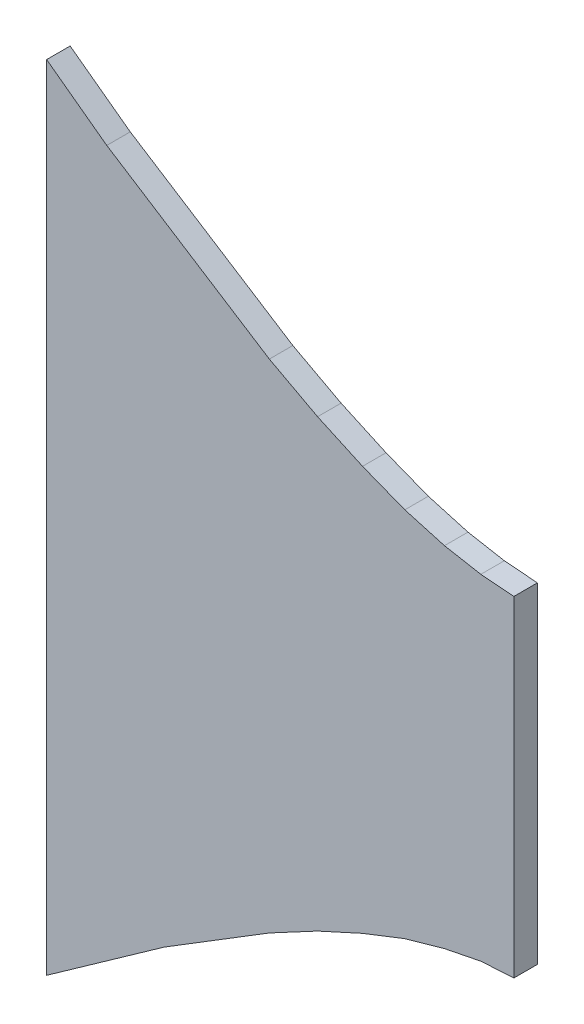
ISO-10303-21;
HEADER;
FILE_DESCRIPTION(('STEP AP214'),'2;1');
FILE_NAME('part.step','',(''),(''),'','','');
FILE_SCHEMA(('AUTOMOTIVE_DESIGN { 1 0 10303 214 1 1 1 1 }'));
ENDSEC;
DATA;
#1=APPLICATION_CONTEXT('core data for automotive mechanical design processes');
#2=APPLICATION_PROTOCOL_DEFINITION('international standard','automotive_design',2000,#1);
#3=PRODUCT_CONTEXT('',#1,'mechanical');
#4=PRODUCT('Part','Part','',(#3));
#5=PRODUCT_RELATED_PRODUCT_CATEGORY('part','',(#4));
#6=PRODUCT_DEFINITION_FORMATION('','',#4);
#7=PRODUCT_DEFINITION_CONTEXT('part definition',#1,'design');
#8=PRODUCT_DEFINITION('design','',#6,#7);
#9=PRODUCT_DEFINITION_SHAPE('','',#8);
#10=(LENGTH_UNIT() NAMED_UNIT(*) SI_UNIT(.MILLI.,.METRE.));
#11=(NAMED_UNIT(*) PLANE_ANGLE_UNIT() SI_UNIT($,.RADIAN.));
#12=(NAMED_UNIT(*) SI_UNIT($,.STERADIAN.) SOLID_ANGLE_UNIT());
#13=UNCERTAINTY_MEASURE_WITH_UNIT(LENGTH_MEASURE(1.E-05),#10,'distance_accuracy_value','');
#14=(GEOMETRIC_REPRESENTATION_CONTEXT(3) GLOBAL_UNCERTAINTY_ASSIGNED_CONTEXT((#13)) GLOBAL_UNIT_ASSIGNED_CONTEXT((#10,
#11,#12)) REPRESENTATION_CONTEXT('',''));
#15=CARTESIAN_POINT('',(0.,0.,0.));
#16=DIRECTION('',(0.,0.,1.));
#17=DIRECTION('',(1.,0.,0.));
#18=AXIS2_PLACEMENT_3D('',#15,#16,#17);
#19=CARTESIAN_POINT('',(94.9879989624023,101.53800201416,0.));
#20=DIRECTION('',(-1.,0.,0.));
#21=DIRECTION('',(0.,1.,0.));
#22=AXIS2_PLACEMENT_3D('',#19,#20,#21);
#23=PLANE('',#22);
#24=DIRECTION('',(0.,1.,0.));
#25=VECTOR('',#24,1.);
#26=CARTESIAN_POINT('',(94.9879989624023,101.53800201416,0.03556));
#27=LINE('',#26,#25);
#28=CARTESIAN_POINT('',(94.9879989624023,101.53800201416,0.03556));
#29=VERTEX_POINT('',#28);
#30=CARTESIAN_POINT('',(94.9879989624023,102.03800201416,0.03556));
#31=VERTEX_POINT('',#30);
#32=EDGE_CURVE('E11',#29,#31,#27,.T.);
#33=ORIENTED_EDGE('',*,*,#32,.F.);
#34=DIRECTION('',(0.,0.,1.));
#35=VECTOR('',#34,1.);
#36=CARTESIAN_POINT('',(94.9879989624023,101.53800201416,0.));
#37=LINE('',#36,#35);
#38=CARTESIAN_POINT('',(94.9879989624023,101.53800201416,0.));
#39=VERTEX_POINT('',#38);
#40=EDGE_CURVE('E24',#39,#29,#37,.T.);
#41=ORIENTED_EDGE('',*,*,#40,.F.);
#42=DIRECTION('',(0.,1.,0.));
#43=VECTOR('',#42,1.);
#44=CARTESIAN_POINT('',(94.9879989624023,101.53800201416,0.));
#45=LINE('',#44,#43);
#46=CARTESIAN_POINT('',(94.9879989624023,102.03800201416,0.));
#47=VERTEX_POINT('',#46);
#48=EDGE_CURVE('E323',#39,#47,#45,.T.);
#49=ORIENTED_EDGE('',*,*,#48,.T.);
#50=DIRECTION('',(0.,0.,1.));
#51=VECTOR('',#50,1.);
#52=CARTESIAN_POINT('',(94.9879989624023,102.03800201416,0.));
#53=LINE('',#52,#51);
#54=EDGE_CURVE('E37',#47,#31,#53,.T.);
#55=ORIENTED_EDGE('',*,*,#54,.T.);
#56=EDGE_LOOP('',(#33,#41,#49,#55));
#57=FACE_BOUND('',#56,.T.);
#58=ADVANCED_FACE('F17',(#57),#23,.F.);
#59=CARTESIAN_POINT('',(94.9380035400391,101.535003662109,0.));
#60=DIRECTION('',(-0.0598649699898658,0.998206484334836,0.));
#61=DIRECTION('',(0.998206484334836,0.0598649699898658,0.));
#62=AXIS2_PLACEMENT_3D('',#59,#60,#61);
#63=PLANE('',#62);
#64=DIRECTION('',(0.998206484334836,0.0598649699898658,0.));
#65=VECTOR('',#64,1.);
#66=CARTESIAN_POINT('',(94.9380035400391,101.535003662109,0.03556));
#67=LINE('',#66,#65);
#68=CARTESIAN_POINT('',(94.9380035400391,101.535003662109,0.03556));
#69=VERTEX_POINT('',#68);
#70=EDGE_CURVE('E319',#69,#29,#67,.T.);
#71=ORIENTED_EDGE('',*,*,#70,.F.);
#72=DIRECTION('',(0.,0.,1.));
#73=VECTOR('',#72,1.);
#74=CARTESIAN_POINT('',(94.9380035400391,101.535003662109,0.));
#75=LINE('',#74,#73);
#76=CARTESIAN_POINT('',(94.9380035400391,101.535003662109,0.));
#77=VERTEX_POINT('',#76);
#78=EDGE_CURVE('E317',#77,#69,#75,.T.);
#79=ORIENTED_EDGE('',*,*,#78,.F.);
#80=DIRECTION('',(0.998206484334836,0.0598649699898658,0.));
#81=VECTOR('',#80,1.);
#82=CARTESIAN_POINT('',(94.9380035400391,101.535003662109,0.));
#83=LINE('',#82,#81);
#84=EDGE_CURVE('E315',#77,#39,#83,.T.);
#85=ORIENTED_EDGE('',*,*,#84,.T.);
#86=ORIENTED_EDGE('',*,*,#40,.T.);
#87=EDGE_LOOP('',(#71,#79,#85,#86));
#88=FACE_BOUND('',#87,.T.);
#89=ADVANCED_FACE('F326',(#88),#63,.F.);
#90=CARTESIAN_POINT('',(94.8830032348633,101.524002075195,0.));
#91=DIRECTION('',(-0.196142292954482,0.980575443764812,0.));
#92=DIRECTION('',(0.980575443764812,0.196142292954482,0.));
#93=AXIS2_PLACEMENT_3D('',#90,#91,#92);
#94=PLANE('',#93);
#95=DIRECTION('',(0.980575443764812,0.196142292954482,0.));
#96=VECTOR('',#95,1.);
#97=CARTESIAN_POINT('',(94.8830032348633,101.524002075195,0.03556));
#98=LINE('',#97,#96);
#99=CARTESIAN_POINT('',(94.8830032348633,101.524002075195,0.03556));
#100=VERTEX_POINT('',#99);
#101=EDGE_CURVE('E312',#100,#69,#98,.T.);
#102=ORIENTED_EDGE('',*,*,#101,.F.);
#103=DIRECTION('',(0.,0.,1.));
#104=VECTOR('',#103,1.);
#105=CARTESIAN_POINT('',(94.8830032348633,101.524002075195,0.));
#106=LINE('',#105,#104);
#107=CARTESIAN_POINT('',(94.8830032348633,101.524002075195,0.));
#108=VERTEX_POINT('',#107);
#109=EDGE_CURVE('E310',#108,#100,#106,.T.);
#110=ORIENTED_EDGE('',*,*,#109,.F.);
#111=DIRECTION('',(0.980575443764812,0.196142292954482,0.));
#112=VECTOR('',#111,1.);
#113=CARTESIAN_POINT('',(94.8830032348633,101.524002075195,0.));
#114=LINE('',#113,#112);
#115=EDGE_CURVE('E307',#108,#77,#114,.T.);
#116=ORIENTED_EDGE('',*,*,#115,.T.);
#117=ORIENTED_EDGE('',*,*,#78,.T.);
#118=EDGE_LOOP('',(#102,#110,#116,#117));
#119=FACE_BOUND('',#118,.T.);
#120=ADVANCED_FACE('F329',(#119),#94,.F.);
#121=CARTESIAN_POINT('',(94.822998046875,101.50700378418,0.));
#122=DIRECTION('',(-0.272555388329589,0.962140093901354,0.));
#123=DIRECTION('',(0.962140093901354,0.272555388329589,0.));
#124=AXIS2_PLACEMENT_3D('',#121,#122,#123);
#125=PLANE('',#124);
#126=DIRECTION('',(0.962140093901354,0.272555388329589,0.));
#127=VECTOR('',#126,1.);
#128=CARTESIAN_POINT('',(94.822998046875,101.50700378418,0.03556));
#129=LINE('',#128,#127);
#130=CARTESIAN_POINT('',(94.822998046875,101.50700378418,0.03556));
#131=VERTEX_POINT('',#130);
#132=EDGE_CURVE('E304',#131,#100,#129,.T.);
#133=ORIENTED_EDGE('',*,*,#132,.F.);
#134=DIRECTION('',(0.,0.,1.));
#135=VECTOR('',#134,1.);
#136=CARTESIAN_POINT('',(94.822998046875,101.50700378418,0.));
#137=LINE('',#136,#135);
#138=CARTESIAN_POINT('',(94.822998046875,101.50700378418,0.));
#139=VERTEX_POINT('',#138);
#140=EDGE_CURVE('E302',#139,#131,#137,.T.);
#141=ORIENTED_EDGE('',*,*,#140,.F.);
#142=DIRECTION('',(0.962140093901354,0.272555388329589,0.));
#143=VECTOR('',#142,1.);
#144=CARTESIAN_POINT('',(94.822998046875,101.50700378418,0.));
#145=LINE('',#144,#143);
#146=EDGE_CURVE('E299',#139,#108,#145,.T.);
#147=ORIENTED_EDGE('',*,*,#146,.T.);
#148=ORIENTED_EDGE('',*,*,#109,.T.);
#149=EDGE_LOOP('',(#133,#141,#147,#148));
#150=FACE_BOUND('',#149,.T.);
#151=ADVANCED_FACE('F334',(#150),#125,.F.);
#152=CARTESIAN_POINT('',(94.7590026855469,101.482002258301,0.));
#153=DIRECTION('',(-0.363892677088273,0.931440883557046,0.));
#154=DIRECTION('',(0.931440883557046,0.363892677088273,0.));
#155=AXIS2_PLACEMENT_3D('',#152,#153,#154);
#156=PLANE('',#155);
#157=DIRECTION('',(0.931440883557046,0.363892677088273,0.));
#158=VECTOR('',#157,1.);
#159=CARTESIAN_POINT('',(94.7590026855469,101.482002258301,0.03556));
#160=LINE('',#159,#158);
#161=CARTESIAN_POINT('',(94.7590026855469,101.482002258301,0.03556));
#162=VERTEX_POINT('',#161);
#163=EDGE_CURVE('E296',#162,#131,#160,.T.);
#164=ORIENTED_EDGE('',*,*,#163,.F.);
#165=DIRECTION('',(0.,0.,1.));
#166=VECTOR('',#165,1.);
#167=CARTESIAN_POINT('',(94.7590026855469,101.482002258301,0.));
#168=LINE('',#167,#166);
#169=CARTESIAN_POINT('',(94.7590026855469,101.482002258301,0.));
#170=VERTEX_POINT('',#169);
#171=EDGE_CURVE('E294',#170,#162,#168,.T.);
#172=ORIENTED_EDGE('',*,*,#171,.F.);
#173=DIRECTION('',(0.931440883557046,0.363892677088273,0.));
#174=VECTOR('',#173,1.);
#175=CARTESIAN_POINT('',(94.7590026855469,101.482002258301,0.));
#176=LINE('',#175,#174);
#177=EDGE_CURVE('E291',#170,#139,#176,.T.);
#178=ORIENTED_EDGE('',*,*,#177,.T.);
#179=ORIENTED_EDGE('',*,*,#140,.T.);
#180=EDGE_LOOP('',(#164,#172,#178,#179));
#181=FACE_BOUND('',#180,.T.);
#182=ADVANCED_FACE('F337',(#181),#156,.F.);
#183=CARTESIAN_POINT('',(94.6910018920898,101.450996398926,0.));
#184=DIRECTION('',(-0.414871750258759,0.90987989912803,0.));
#185=DIRECTION('',(0.90987989912803,0.414871750258759,0.));
#186=AXIS2_PLACEMENT_3D('',#183,#184,#185);
#187=PLANE('',#186);
#188=DIRECTION('',(0.90987989912803,0.414871750258759,0.));
#189=VECTOR('',#188,1.);
#190=CARTESIAN_POINT('',(94.6910018920898,101.450996398926,0.03556));
#191=LINE('',#190,#189);
#192=CARTESIAN_POINT('',(94.6910018920898,101.450996398926,0.03556));
#193=VERTEX_POINT('',#192);
#194=EDGE_CURVE('E288',#193,#162,#191,.T.);
#195=ORIENTED_EDGE('',*,*,#194,.F.);
#196=DIRECTION('',(0.,0.,1.));
#197=VECTOR('',#196,1.);
#198=CARTESIAN_POINT('',(94.6910018920898,101.450996398926,0.));
#199=LINE('',#198,#197);
#200=CARTESIAN_POINT('',(94.6910018920898,101.450996398926,0.));
#201=VERTEX_POINT('',#200);
#202=EDGE_CURVE('E286',#201,#193,#199,.T.);
#203=ORIENTED_EDGE('',*,*,#202,.F.);
#204=DIRECTION('',(0.90987989912803,0.414871750258759,0.));
#205=VECTOR('',#204,1.);
#206=CARTESIAN_POINT('',(94.6910018920898,101.450996398926,0.));
#207=LINE('',#206,#205);
#208=EDGE_CURVE('E283',#201,#170,#207,.T.);
#209=ORIENTED_EDGE('',*,*,#208,.T.);
#210=ORIENTED_EDGE('',*,*,#171,.T.);
#211=EDGE_LOOP('',(#195,#203,#209,#210));
#212=FACE_BOUND('',#211,.T.);
#213=ADVANCED_FACE('F342',(#212),#187,.F.);
#214=CARTESIAN_POINT('',(94.6179962158203,101.412002563477,0.));
#215=DIRECTION('',(-0.471128783774778,0.882064435910948,0.));
#216=DIRECTION('',(0.882064435910948,0.471128783774778,0.));
#217=AXIS2_PLACEMENT_3D('',#214,#215,#216);
#218=PLANE('',#217);
#219=DIRECTION('',(0.882064435910948,0.471128783774778,0.));
#220=VECTOR('',#219,1.);
#221=CARTESIAN_POINT('',(94.6179962158203,101.412002563477,0.03556));
#222=LINE('',#221,#220);
#223=CARTESIAN_POINT('',(94.6179962158203,101.412002563477,0.03556));
#224=VERTEX_POINT('',#223);
#225=EDGE_CURVE('E280',#224,#193,#222,.T.);
#226=ORIENTED_EDGE('',*,*,#225,.F.);
#227=DIRECTION('',(0.,0.,1.));
#228=VECTOR('',#227,1.);
#229=CARTESIAN_POINT('',(94.6179962158203,101.412002563477,0.));
#230=LINE('',#229,#228);
#231=CARTESIAN_POINT('',(94.6179962158203,101.412002563477,0.));
#232=VERTEX_POINT('',#231);
#233=EDGE_CURVE('E278',#232,#224,#230,.T.);
#234=ORIENTED_EDGE('',*,*,#233,.F.);
#235=DIRECTION('',(0.882064435910948,0.471128783774778,0.));
#236=VECTOR('',#235,1.);
#237=CARTESIAN_POINT('',(94.6179962158203,101.412002563477,0.));
#238=LINE('',#237,#236);
#239=EDGE_CURVE('E275',#232,#201,#238,.T.);
#240=ORIENTED_EDGE('',*,*,#239,.T.);
#241=ORIENTED_EDGE('',*,*,#202,.T.);
#242=EDGE_LOOP('',(#226,#234,#240,#241));
#243=FACE_BOUND('',#242,.T.);
#244=ADVANCED_FACE('F345',(#243),#218,.F.);
#245=CARTESIAN_POINT('',(94.4589996337891,101.314002990723,0.));
#246=DIRECTION('',(-0.5247012582239,0.851286432182645,0.));
#247=DIRECTION('',(0.851286432182645,0.5247012582239,0.));
#248=AXIS2_PLACEMENT_3D('',#245,#246,#247);
#249=PLANE('',#248);
#250=DIRECTION('',(0.851286432182645,0.5247012582239,0.));
#251=VECTOR('',#250,1.);
#252=CARTESIAN_POINT('',(94.4589996337891,101.314002990723,0.03556));
#253=LINE('',#252,#251);
#254=CARTESIAN_POINT('',(94.4589996337891,101.314002990723,0.03556));
#255=VERTEX_POINT('',#254);
#256=EDGE_CURVE('E272',#255,#224,#253,.T.);
#257=ORIENTED_EDGE('',*,*,#256,.F.);
#258=DIRECTION('',(0.,0.,1.));
#259=VECTOR('',#258,1.);
#260=CARTESIAN_POINT('',(94.4589996337891,101.314002990723,0.));
#261=LINE('',#260,#259);
#262=CARTESIAN_POINT('',(94.4589996337891,101.314002990723,0.));
#263=VERTEX_POINT('',#262);
#264=EDGE_CURVE('E270',#263,#255,#261,.T.);
#265=ORIENTED_EDGE('',*,*,#264,.F.);
#266=DIRECTION('',(0.851286432182645,0.5247012582239,0.));
#267=VECTOR('',#266,1.);
#268=CARTESIAN_POINT('',(94.4589996337891,101.314002990723,0.));
#269=LINE('',#268,#267);
#270=EDGE_CURVE('E267',#263,#232,#269,.T.);
#271=ORIENTED_EDGE('',*,*,#270,.T.);
#272=ORIENTED_EDGE('',*,*,#233,.T.);
#273=EDGE_LOOP('',(#257,#265,#271,#272));
#274=FACE_BOUND('',#273,.T.);
#275=ADVANCED_FACE('F350',(#274),#249,.F.);
#276=CARTESIAN_POINT('',(94.2809982299805,101.188003540039,0.));
#277=DIRECTION('',(-0.577758148093519,0.816208014118673,0.));
#278=DIRECTION('',(0.816208014118673,0.577758148093519,0.));
#279=AXIS2_PLACEMENT_3D('',#276,#277,#278);
#280=PLANE('',#279);
#281=DIRECTION('',(0.816208014118673,0.577758148093519,0.));
#282=VECTOR('',#281,1.);
#283=CARTESIAN_POINT('',(94.2809982299805,101.188003540039,0.03556));
#284=LINE('',#283,#282);
#285=CARTESIAN_POINT('',(94.2809982299805,101.188003540039,0.03556));
#286=VERTEX_POINT('',#285);
#287=EDGE_CURVE('E264',#286,#255,#284,.T.);
#288=ORIENTED_EDGE('',*,*,#287,.F.);
#289=DIRECTION('',(0.,0.,1.));
#290=VECTOR('',#289,1.);
#291=CARTESIAN_POINT('',(94.2809982299805,101.188003540039,0.));
#292=LINE('',#291,#290);
#293=CARTESIAN_POINT('',(94.2809982299805,101.188003540039,0.));
#294=VERTEX_POINT('',#293);
#295=EDGE_CURVE('E262',#294,#286,#292,.T.);
#296=ORIENTED_EDGE('',*,*,#295,.F.);
#297=DIRECTION('',(0.816208014118673,0.577758148093519,0.));
#298=VECTOR('',#297,1.);
#299=CARTESIAN_POINT('',(94.2809982299805,101.188003540039,0.));
#300=LINE('',#299,#298);
#301=EDGE_CURVE('E259',#294,#263,#300,.T.);
#302=ORIENTED_EDGE('',*,*,#301,.T.);
#303=ORIENTED_EDGE('',*,*,#264,.T.);
#304=EDGE_LOOP('',(#288,#296,#302,#303));
#305=FACE_BOUND('',#304,.T.);
#306=ADVANCED_FACE('F353',(#305),#280,.F.);
#307=CARTESIAN_POINT('',(94.2809982299805,101.786005060845,0.));
#308=DIRECTION('',(1.,0.,0.));
#309=DIRECTION('',(0.,-1.,0.));
#310=AXIS2_PLACEMENT_3D('',#307,#308,#309);
#311=PLANE('',#310);
#312=DIRECTION('',(0.,-1.,0.));
#313=VECTOR('',#312,1.);
#314=CARTESIAN_POINT('',(94.2809982299805,102.388000488281,0.03556));
#315=LINE('',#314,#313);
#316=CARTESIAN_POINT('',(94.2809982299805,101.786005060845,0.03556));
#317=VERTEX_POINT('',#316);
#318=EDGE_CURVE('E256',#317,#286,#315,.T.);
#319=ORIENTED_EDGE('',*,*,#318,.F.);
#320=DIRECTION('',(0.,0.,1.));
#321=VECTOR('',#320,1.);
#322=CARTESIAN_POINT('',(94.2809982299805,101.786005060845,0.));
#323=LINE('',#322,#321);
#324=CARTESIAN_POINT('',(94.2809982299805,101.786005060845,0.));
#325=VERTEX_POINT('',#324);
#326=EDGE_CURVE('E254',#325,#317,#323,.T.);
#327=ORIENTED_EDGE('',*,*,#326,.F.);
#328=DIRECTION('',(0.,-1.,0.));
#329=VECTOR('',#328,1.);
#330=CARTESIAN_POINT('',(94.2809982299805,102.388000488281,0.));
#331=LINE('',#330,#329);
#332=EDGE_CURVE('E251',#325,#294,#331,.T.);
#333=ORIENTED_EDGE('',*,*,#332,.T.);
#334=ORIENTED_EDGE('',*,*,#295,.T.);
#335=EDGE_LOOP('',(#319,#327,#333,#334));
#336=FACE_BOUND('',#335,.T.);
#337=ADVANCED_FACE('F358',(#336),#311,.F.);
#338=CARTESIAN_POINT('',(93.8310036,101.7880108,0.));
#339=DIRECTION('',(0.,0.,-1.));
#340=DIRECTION('',(1.,0.,0.));
#341=AXIS2_PLACEMENT_3D('',#338,#339,#340);
#342=CYLINDRICAL_SURFACE('',#341,0.4499991);
#343=ORIENTED_EDGE('',*,*,#326,.T.);
#344=CARTESIAN_POINT('',(93.8310036,101.7880108,0.03556));
#345=DIRECTION('',(0.,0.,1.));
#346=DIRECTION('',(1.,0.,0.));
#347=AXIS2_PLACEMENT_3D('',#344,#345,#346);
#348=CIRCLE('',#347,0.4499991);
#349=CARTESIAN_POINT('',(94.2810027,101.7880108,0.03556));
#350=VERTEX_POINT('',#349);
#351=EDGE_CURVE('E248',#317,#350,#348,.T.);
#352=ORIENTED_EDGE('',*,*,#351,.T.);
#353=DIRECTION('',(0.,0.,1.));
#354=VECTOR('',#353,1.);
#355=CARTESIAN_POINT('',(94.2810027,101.7880108,0.));
#356=LINE('',#355,#354);
#357=CARTESIAN_POINT('',(94.2810027,101.7880108,0.));
#358=VERTEX_POINT('',#357);
#359=EDGE_CURVE('E246',#358,#350,#356,.T.);
#360=ORIENTED_EDGE('',*,*,#359,.F.);
#361=CARTESIAN_POINT('',(93.8310036,101.7880108,0.));
#362=DIRECTION('',(0.,0.,1.));
#363=DIRECTION('',(1.,0.,0.));
#364=AXIS2_PLACEMENT_3D('',#361,#362,#363);
#365=CIRCLE('',#364,0.4499991);
#366=EDGE_CURVE('E243',#325,#358,#365,.T.);
#367=ORIENTED_EDGE('',*,*,#366,.F.);
#368=EDGE_LOOP('',(#343,#352,#360,#367));
#369=FACE_BOUND('',#368,.T.);
#370=ADVANCED_FACE('F361',(#369),#342,.F.);
#371=CARTESIAN_POINT('',(93.8310036,101.7880108,0.));
#372=DIRECTION('',(0.,0.,-1.));
#373=DIRECTION('',(1.,0.,0.));
#374=AXIS2_PLACEMENT_3D('',#371,#372,#373);
#375=CYLINDRICAL_SURFACE('',#374,0.4499991);
#376=ORIENTED_EDGE('',*,*,#359,.T.);
#377=CARTESIAN_POINT('',(93.8310036,101.7880108,0.03556));
#378=DIRECTION('',(0.,0.,1.));
#379=DIRECTION('',(1.,0.,0.));
#380=AXIS2_PLACEMENT_3D('',#377,#378,#379);
#381=CIRCLE('',#380,0.4499991);
#382=CARTESIAN_POINT('',(94.2809982299805,101.790016539153,0.03556));
#383=VERTEX_POINT('',#382);
#384=EDGE_CURVE('E240',#350,#383,#381,.T.);
#385=ORIENTED_EDGE('',*,*,#384,.T.);
#386=DIRECTION('',(0.,0.,1.));
#387=VECTOR('',#386,1.);
#388=CARTESIAN_POINT('',(94.2809982299805,101.790016539153,0.));
#389=LINE('',#388,#387);
#390=CARTESIAN_POINT('',(94.2809982299805,101.790016539153,0.));
#391=VERTEX_POINT('',#390);
#392=EDGE_CURVE('E238',#391,#383,#389,.T.);
#393=ORIENTED_EDGE('',*,*,#392,.F.);
#394=EDGE_CURVE('E237',#358,#391,#365,.T.);
#395=ORIENTED_EDGE('',*,*,#394,.F.);
#396=EDGE_LOOP('',(#376,#385,#393,#395));
#397=FACE_BOUND('',#396,.T.);
#398=ADVANCED_FACE('F368',(#397),#375,.F.);
#399=CARTESIAN_POINT('',(94.2809982299805,102.388000488281,0.));
#400=DIRECTION('',(1.,0.,0.));
#401=DIRECTION('',(0.,-1.,0.));
#402=AXIS2_PLACEMENT_3D('',#399,#400,#401);
#403=PLANE('',#402);
#404=DIRECTION('',(0.,-1.,0.));
#405=VECTOR('',#404,1.);
#406=CARTESIAN_POINT('',(94.2809982299805,102.388000488281,0.03556));
#407=LINE('',#406,#405);
#408=CARTESIAN_POINT('',(94.2809982299805,102.388000488281,0.03556));
#409=VERTEX_POINT('',#408);
#410=EDGE_CURVE('E234',#409,#383,#407,.T.);
#411=ORIENTED_EDGE('',*,*,#410,.F.);
#412=DIRECTION('',(0.,0.,1.));
#413=VECTOR('',#412,1.);
#414=CARTESIAN_POINT('',(94.2809982299805,102.388000488281,0.));
#415=LINE('',#414,#413);
#416=CARTESIAN_POINT('',(94.2809982299805,102.388000488281,0.));
#417=VERTEX_POINT('',#416);
#418=EDGE_CURVE('E232',#417,#409,#415,.T.);
#419=ORIENTED_EDGE('',*,*,#418,.F.);
#420=EDGE_CURVE('E231',#417,#391,#331,.T.);
#421=ORIENTED_EDGE('',*,*,#420,.T.);
#422=ORIENTED_EDGE('',*,*,#392,.T.);
#423=EDGE_LOOP('',(#411,#419,#421,#422));
#424=FACE_BOUND('',#423,.T.);
#425=ADVANCED_FACE('F371',(#424),#403,.F.);
#426=CARTESIAN_POINT('',(94.3720016479492,102.320999145508,0.));
#427=DIRECTION('',(-0.592890402804805,-0.805283161541302,0.));
#428=DIRECTION('',(-0.805283161541302,0.592890402804805,0.));
#429=AXIS2_PLACEMENT_3D('',#426,#427,#428);
#430=PLANE('',#429);
#431=DIRECTION('',(-0.805283161541302,0.592890402804805,0.));
#432=VECTOR('',#431,1.);
#433=CARTESIAN_POINT('',(94.3720016479492,102.320999145508,0.03556));
#434=LINE('',#433,#432);
#435=CARTESIAN_POINT('',(94.3720016479492,102.320999145508,0.03556));
#436=VERTEX_POINT('',#435);
#437=EDGE_CURVE('E228',#436,#409,#434,.T.);
#438=ORIENTED_EDGE('',*,*,#437,.F.);
#439=DIRECTION('',(0.,0.,1.));
#440=VECTOR('',#439,1.);
#441=CARTESIAN_POINT('',(94.3720016479492,102.320999145508,0.));
#442=LINE('',#441,#440);
#443=CARTESIAN_POINT('',(94.3720016479492,102.320999145508,0.));
#444=VERTEX_POINT('',#443);
#445=EDGE_CURVE('E226',#444,#436,#442,.T.);
#446=ORIENTED_EDGE('',*,*,#445,.F.);
#447=DIRECTION('',(-0.805283161541302,0.592890402804805,0.));
#448=VECTOR('',#447,1.);
#449=CARTESIAN_POINT('',(94.3720016479492,102.320999145508,0.));
#450=LINE('',#449,#448);
#451=EDGE_CURVE('E223',#444,#417,#450,.T.);
#452=ORIENTED_EDGE('',*,*,#451,.T.);
#453=ORIENTED_EDGE('',*,*,#418,.T.);
#454=EDGE_LOOP('',(#438,#446,#452,#453));
#455=FACE_BOUND('',#454,.T.);
#456=ADVANCED_FACE('F376',(#455),#430,.F.);
#457=CARTESIAN_POINT('',(94.6179962158203,102.164001464844,0.));
#458=DIRECTION('',(-0.53798644401122,-0.842953489855854,0.));
#459=DIRECTION('',(-0.842953489855854,0.53798644401122,0.));
#460=AXIS2_PLACEMENT_3D('',#457,#458,#459);
#461=PLANE('',#460);
#462=DIRECTION('',(-0.842953489855854,0.53798644401122,0.));
#463=VECTOR('',#462,1.);
#464=CARTESIAN_POINT('',(94.6179962158203,102.164001464844,0.03556));
#465=LINE('',#464,#463);
#466=CARTESIAN_POINT('',(94.6179962158203,102.164001464844,0.03556));
#467=VERTEX_POINT('',#466);
#468=EDGE_CURVE('E220',#467,#436,#465,.T.);
#469=ORIENTED_EDGE('',*,*,#468,.F.);
#470=DIRECTION('',(0.,0.,1.));
#471=VECTOR('',#470,1.);
#472=CARTESIAN_POINT('',(94.6179962158203,102.164001464844,0.));
#473=LINE('',#472,#471);
#474=CARTESIAN_POINT('',(94.6179962158203,102.164001464844,0.));
#475=VERTEX_POINT('',#474);
#476=EDGE_CURVE('E218',#475,#467,#473,.T.);
#477=ORIENTED_EDGE('',*,*,#476,.F.);
#478=DIRECTION('',(-0.842953489855854,0.53798644401122,0.));
#479=VECTOR('',#478,1.);
#480=CARTESIAN_POINT('',(94.6179962158203,102.164001464844,0.));
#481=LINE('',#480,#479);
#482=EDGE_CURVE('E215',#475,#444,#481,.T.);
#483=ORIENTED_EDGE('',*,*,#482,.T.);
#484=ORIENTED_EDGE('',*,*,#445,.T.);
#485=EDGE_LOOP('',(#469,#477,#483,#484));
#486=FACE_BOUND('',#485,.T.);
#487=ADVANCED_FACE('F379',(#486),#461,.F.);
#488=CARTESIAN_POINT('',(94.6910018920898,102.125,0.));
#489=DIRECTION('',(-0.471200498128635,-0.882026128050256,0.));
#490=DIRECTION('',(-0.882026128050256,0.471200498128635,0.));
#491=AXIS2_PLACEMENT_3D('',#488,#489,#490);
#492=PLANE('',#491);
#493=DIRECTION('',(-0.882026128050256,0.471200498128635,0.));
#494=VECTOR('',#493,1.);
#495=CARTESIAN_POINT('',(94.6910018920898,102.125,0.03556));
#496=LINE('',#495,#494);
#497=CARTESIAN_POINT('',(94.6910018920898,102.125,0.03556));
#498=VERTEX_POINT('',#497);
#499=EDGE_CURVE('E212',#498,#467,#496,.T.);
#500=ORIENTED_EDGE('',*,*,#499,.F.);
#501=DIRECTION('',(0.,0.,1.));
#502=VECTOR('',#501,1.);
#503=CARTESIAN_POINT('',(94.6910018920898,102.125,0.));
#504=LINE('',#503,#502);
#505=CARTESIAN_POINT('',(94.6910018920898,102.125,0.));
#506=VERTEX_POINT('',#505);
#507=EDGE_CURVE('E210',#506,#498,#504,.T.);
#508=ORIENTED_EDGE('',*,*,#507,.F.);
#509=DIRECTION('',(-0.882026128050256,0.471200498128635,0.));
#510=VECTOR('',#509,1.);
#511=CARTESIAN_POINT('',(94.6910018920898,102.125,0.));
#512=LINE('',#511,#510);
#513=EDGE_CURVE('E207',#506,#475,#512,.T.);
#514=ORIENTED_EDGE('',*,*,#513,.T.);
#515=ORIENTED_EDGE('',*,*,#476,.T.);
#516=EDGE_LOOP('',(#500,#508,#514,#515));
#517=FACE_BOUND('',#516,.T.);
#518=ADVANCED_FACE('F384',(#517),#492,.F.);
#519=CARTESIAN_POINT('',(94.7590026855469,102.09400177002,0.));
#520=DIRECTION('',(-0.414787230958169,-0.909918432077323,0.));
#521=DIRECTION('',(-0.909918432077323,0.414787230958169,0.));
#522=AXIS2_PLACEMENT_3D('',#519,#520,#521);
#523=PLANE('',#522);
#524=DIRECTION('',(-0.909918432077323,0.414787230958169,0.));
#525=VECTOR('',#524,1.);
#526=CARTESIAN_POINT('',(94.7590026855469,102.09400177002,0.03556));
#527=LINE('',#526,#525);
#528=CARTESIAN_POINT('',(94.7590026855469,102.09400177002,0.03556));
#529=VERTEX_POINT('',#528);
#530=EDGE_CURVE('E204',#529,#498,#527,.T.);
#531=ORIENTED_EDGE('',*,*,#530,.F.);
#532=DIRECTION('',(0.,0.,1.));
#533=VECTOR('',#532,1.);
#534=CARTESIAN_POINT('',(94.7590026855469,102.09400177002,0.));
#535=LINE('',#534,#533);
#536=CARTESIAN_POINT('',(94.7590026855469,102.09400177002,0.));
#537=VERTEX_POINT('',#536);
#538=EDGE_CURVE('E202',#537,#529,#535,.T.);
#539=ORIENTED_EDGE('',*,*,#538,.F.);
#540=DIRECTION('',(-0.909918432077323,0.414787230958169,0.));
#541=VECTOR('',#540,1.);
#542=CARTESIAN_POINT('',(94.7590026855469,102.09400177002,0.));
#543=LINE('',#542,#541);
#544=EDGE_CURVE('E199',#537,#506,#543,.T.);
#545=ORIENTED_EDGE('',*,*,#544,.T.);
#546=ORIENTED_EDGE('',*,*,#507,.T.);
#547=EDGE_LOOP('',(#531,#539,#545,#546));
#548=FACE_BOUND('',#547,.T.);
#549=ADVANCED_FACE('F387',(#548),#523,.F.);
#550=CARTESIAN_POINT('',(94.822998046875,102.069000244141,0.));
#551=DIRECTION('',(-0.363892677088273,-0.931440883557046,0.));
#552=DIRECTION('',(-0.931440883557046,0.363892677088273,0.));
#553=AXIS2_PLACEMENT_3D('',#550,#551,#552);
#554=PLANE('',#553);
#555=DIRECTION('',(-0.931440883557046,0.363892677088273,0.));
#556=VECTOR('',#555,1.);
#557=CARTESIAN_POINT('',(94.822998046875,102.069000244141,0.03556));
#558=LINE('',#557,#556);
#559=CARTESIAN_POINT('',(94.822998046875,102.069000244141,0.03556));
#560=VERTEX_POINT('',#559);
#561=EDGE_CURVE('E196',#560,#529,#558,.T.);
#562=ORIENTED_EDGE('',*,*,#561,.F.);
#563=DIRECTION('',(0.,0.,1.));
#564=VECTOR('',#563,1.);
#565=CARTESIAN_POINT('',(94.822998046875,102.069000244141,0.));
#566=LINE('',#565,#564);
#567=CARTESIAN_POINT('',(94.822998046875,102.069000244141,0.));
#568=VERTEX_POINT('',#567);
#569=EDGE_CURVE('E194',#568,#560,#566,.T.);
#570=ORIENTED_EDGE('',*,*,#569,.F.);
#571=DIRECTION('',(-0.931440883557046,0.363892677088273,0.));
#572=VECTOR('',#571,1.);
#573=CARTESIAN_POINT('',(94.822998046875,102.069000244141,0.));
#574=LINE('',#573,#572);
#575=EDGE_CURVE('E191',#568,#537,#574,.T.);
#576=ORIENTED_EDGE('',*,*,#575,.T.);
#577=ORIENTED_EDGE('',*,*,#538,.T.);
#578=EDGE_LOOP('',(#562,#570,#576,#577));
#579=FACE_BOUND('',#578,.T.);
#580=ADVANCED_FACE('F390',(#579),#554,.F.);
#581=CARTESIAN_POINT('',(94.8830032348633,102.052001953125,0.));
#582=DIRECTION('',(-0.272555388329589,-0.962140093901354,0.));
#583=DIRECTION('',(-0.962140093901354,0.272555388329589,0.));
#584=AXIS2_PLACEMENT_3D('',#581,#582,#583);
#585=PLANE('',#584);
#586=DIRECTION('',(-0.962140093901354,0.272555388329589,0.));
#587=VECTOR('',#586,1.);
#588=CARTESIAN_POINT('',(94.8830032348633,102.052001953125,0.03556));
#589=LINE('',#588,#587);
#590=CARTESIAN_POINT('',(94.8830032348633,102.052001953125,0.03556));
#591=VERTEX_POINT('',#590);
#592=EDGE_CURVE('E188',#591,#560,#589,.T.);
#593=ORIENTED_EDGE('',*,*,#592,.F.);
#594=DIRECTION('',(0.,0.,1.));
#595=VECTOR('',#594,1.);
#596=CARTESIAN_POINT('',(94.8830032348633,102.052001953125,0.));
#597=LINE('',#596,#595);
#598=CARTESIAN_POINT('',(94.8830032348633,102.052001953125,0.));
#599=VERTEX_POINT('',#598);
#600=EDGE_CURVE('E186',#599,#591,#597,.T.);
#601=ORIENTED_EDGE('',*,*,#600,.F.);
#602=DIRECTION('',(-0.962140093901354,0.272555388329589,0.));
#603=VECTOR('',#602,1.);
#604=CARTESIAN_POINT('',(94.8830032348633,102.052001953125,0.));
#605=LINE('',#604,#603);
#606=EDGE_CURVE('E177',#599,#568,#605,.T.);
#607=ORIENTED_EDGE('',*,*,#606,.T.);
#608=ORIENTED_EDGE('',*,*,#569,.T.);
#609=EDGE_LOOP('',(#593,#601,#607,#608));
#610=FACE_BOUND('',#609,.T.);
#611=ADVANCED_FACE('F393',(#610),#585,.F.);
#612=CARTESIAN_POINT('',(94.9380035400391,102.041999816895,0.));
#613=DIRECTION('',(-0.178921468032407,-0.983863358539756,0.));
#614=DIRECTION('',(-0.983863358539756,0.178921468032407,0.));
#615=AXIS2_PLACEMENT_3D('',#612,#613,#614);
#616=PLANE('',#615);
#617=DIRECTION('',(-0.983863358539756,0.178921468032407,0.));
#618=VECTOR('',#617,1.);
#619=CARTESIAN_POINT('',(94.9380035400391,102.041999816895,0.03556));
#620=LINE('',#619,#618);
#621=CARTESIAN_POINT('',(94.9380035400391,102.041999816895,0.03556));
#622=VERTEX_POINT('',#621);
#623=EDGE_CURVE('E163',#622,#591,#620,.T.);
#624=ORIENTED_EDGE('',*,*,#623,.F.);
#625=DIRECTION('',(0.,0.,1.));
#626=VECTOR('',#625,1.);
#627=CARTESIAN_POINT('',(94.9380035400391,102.041999816895,0.));
#628=LINE('',#627,#626);
#629=CARTESIAN_POINT('',(94.9380035400391,102.041999816895,0.));
#630=VERTEX_POINT('',#629);
#631=EDGE_CURVE('E158',#630,#622,#628,.T.);
#632=ORIENTED_EDGE('',*,*,#631,.F.);
#633=DIRECTION('',(-0.983863358539756,0.178921468032407,0.));
#634=VECTOR('',#633,1.);
#635=CARTESIAN_POINT('',(94.9380035400391,102.041999816895,0.));
#636=LINE('',#635,#634);
#637=EDGE_CURVE('E161',#630,#599,#636,.T.);
#638=ORIENTED_EDGE('',*,*,#637,.T.);
#639=ORIENTED_EDGE('',*,*,#600,.T.);
#640=EDGE_LOOP('',(#624,#632,#638,#639));
#641=FACE_BOUND('',#640,.T.);
#642=ADVANCED_FACE('F160',(#641),#616,.F.);
#643=CARTESIAN_POINT('',(94.9879989624023,102.03800201416,0.));
#644=DIRECTION('',(-0.0797089464804637,-0.996818179936028,0.));
#645=DIRECTION('',(-0.996818179936028,0.0797089464804637,0.));
#646=AXIS2_PLACEMENT_3D('',#643,#644,#645);
#647=PLANE('',#646);
#648=DIRECTION('',(-0.996818179936028,0.0797089464804637,0.));
#649=VECTOR('',#648,1.);
#650=CARTESIAN_POINT('',(94.9879989624023,102.03800201416,0.03556));
#651=LINE('',#650,#649);
#652=EDGE_CURVE('E178',#31,#622,#651,.T.);
#653=ORIENTED_EDGE('',*,*,#652,.F.);
#654=ORIENTED_EDGE('',*,*,#54,.F.);
#655=DIRECTION('',(-0.996818179936028,0.0797089464804637,0.));
#656=VECTOR('',#655,1.);
#657=CARTESIAN_POINT('',(94.9879989624023,102.03800201416,0.));
#658=LINE('',#657,#656);
#659=EDGE_CURVE('E174',#47,#630,#658,.T.);
#660=ORIENTED_EDGE('',*,*,#659,.T.);
#661=ORIENTED_EDGE('',*,*,#631,.T.);
#662=EDGE_LOOP('',(#653,#654,#660,#661));
#663=FACE_BOUND('',#662,.T.);
#664=ADVANCED_FACE('F180',(#663),#647,.F.);
#665=CARTESIAN_POINT('',(94.9879989624023,102.03800201416,0.));
#666=DIRECTION('',(0.,0.,1.));
#667=DIRECTION('',(1.,0.,0.));
#668=AXIS2_PLACEMENT_3D('',#665,#666,#667);
#669=PLANE('',#668);
#670=ORIENTED_EDGE('',*,*,#659,.F.);
#671=ORIENTED_EDGE('',*,*,#48,.F.);
#672=ORIENTED_EDGE('',*,*,#84,.F.);
#673=ORIENTED_EDGE('',*,*,#115,.F.);
#674=ORIENTED_EDGE('',*,*,#146,.F.);
#675=ORIENTED_EDGE('',*,*,#177,.F.);
#676=ORIENTED_EDGE('',*,*,#208,.F.);
#677=ORIENTED_EDGE('',*,*,#239,.F.);
#678=ORIENTED_EDGE('',*,*,#270,.F.);
#679=ORIENTED_EDGE('',*,*,#301,.F.);
#680=ORIENTED_EDGE('',*,*,#332,.F.);
#681=ORIENTED_EDGE('',*,*,#366,.T.);
#682=ORIENTED_EDGE('',*,*,#394,.T.);
#683=ORIENTED_EDGE('',*,*,#420,.F.);
#684=ORIENTED_EDGE('',*,*,#451,.F.);
#685=ORIENTED_EDGE('',*,*,#482,.F.);
#686=ORIENTED_EDGE('',*,*,#513,.F.);
#687=ORIENTED_EDGE('',*,*,#544,.F.);
#688=ORIENTED_EDGE('',*,*,#575,.F.);
#689=ORIENTED_EDGE('',*,*,#606,.F.);
#690=ORIENTED_EDGE('',*,*,#637,.F.);
#691=EDGE_LOOP('',(#670,#671,#672,#673,#674,#675,#676,#677,#678,#679,#680,#681,#682,#683,#684,
#685,#686,#687,#688,#689,#690));
#692=FACE_BOUND('',#691,.T.);
#693=ADVANCED_FACE('F172',(#692),#669,.F.);
#694=CARTESIAN_POINT('',(94.9879989624023,102.03800201416,0.03556));
#695=DIRECTION('',(0.,0.,1.));
#696=DIRECTION('',(1.,0.,0.));
#697=AXIS2_PLACEMENT_3D('',#694,#695,#696);
#698=PLANE('',#697);
#699=ORIENTED_EDGE('',*,*,#32,.T.);
#700=ORIENTED_EDGE('',*,*,#652,.T.);
#701=ORIENTED_EDGE('',*,*,#623,.T.);
#702=ORIENTED_EDGE('',*,*,#592,.T.);
#703=ORIENTED_EDGE('',*,*,#561,.T.);
#704=ORIENTED_EDGE('',*,*,#530,.T.);
#705=ORIENTED_EDGE('',*,*,#499,.T.);
#706=ORIENTED_EDGE('',*,*,#468,.T.);
#707=ORIENTED_EDGE('',*,*,#437,.T.);
#708=ORIENTED_EDGE('',*,*,#410,.T.);
#709=ORIENTED_EDGE('',*,*,#384,.F.);
#710=ORIENTED_EDGE('',*,*,#351,.F.);
#711=ORIENTED_EDGE('',*,*,#318,.T.);
#712=ORIENTED_EDGE('',*,*,#287,.T.);
#713=ORIENTED_EDGE('',*,*,#256,.T.);
#714=ORIENTED_EDGE('',*,*,#225,.T.);
#715=ORIENTED_EDGE('',*,*,#194,.T.);
#716=ORIENTED_EDGE('',*,*,#163,.T.);
#717=ORIENTED_EDGE('',*,*,#132,.T.);
#718=ORIENTED_EDGE('',*,*,#101,.T.);
#719=ORIENTED_EDGE('',*,*,#70,.T.);
#720=EDGE_LOOP('',(#699,#700,#701,#702,#703,#704,#705,#706,#707,#708,#709,#710,#711,#712,#713,
#714,#715,#716,#717,#718,#719));
#721=FACE_BOUND('',#720,.T.);
#722=ADVANCED_FACE('F395',(#721),#698,.T.);
#723=CLOSED_SHELL('',(#58,#89,#120,#151,#182,#213,#244,#275,#306,#337,#370,#398,#425,#456,#487,
#518,#549,#580,#611,#642,#664,#693,#722));
#724=MANIFOLD_SOLID_BREP('B1',#723);
#725=ADVANCED_BREP_SHAPE_REPRESENTATION('',(#18,#724),#14);
#726=SHAPE_DEFINITION_REPRESENTATION(#9,#725);
ENDSEC;
END-ISO-10303-21;
